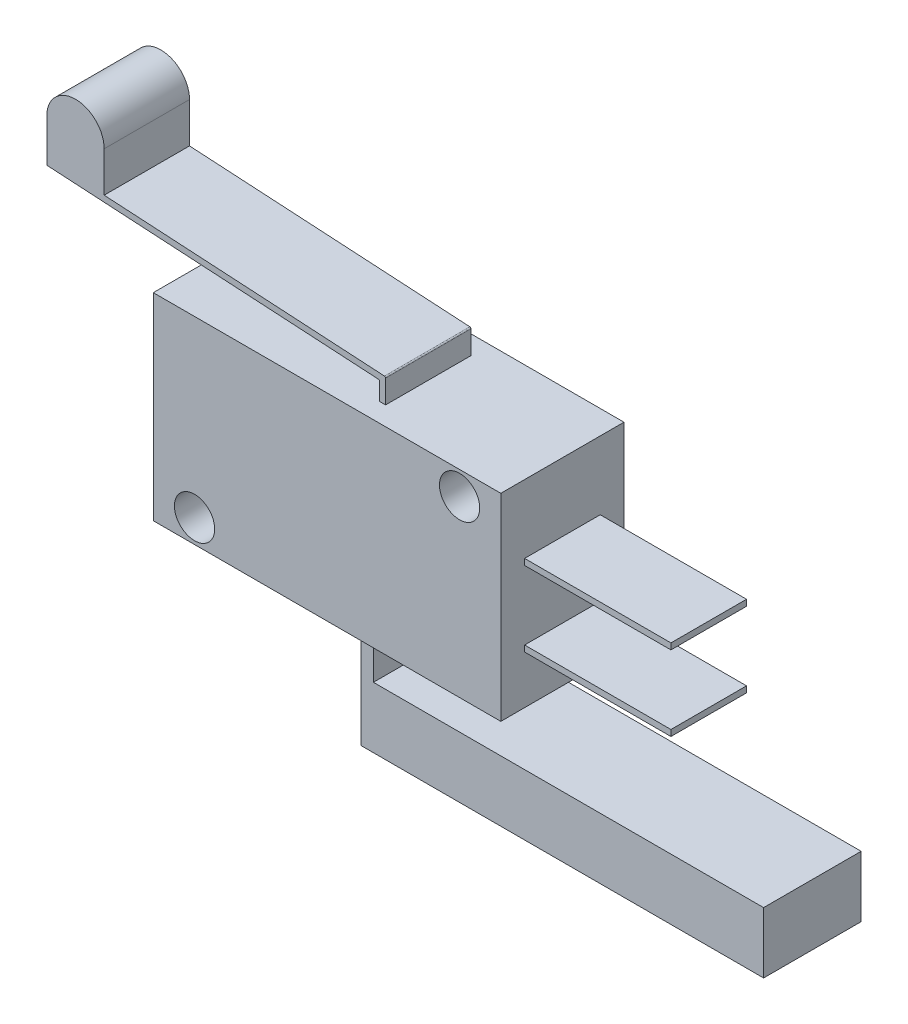
ISO-10303-21;
HEADER;
FILE_DESCRIPTION(('STEP AP214'),'2;1');
FILE_NAME('part.step','',(''),(''),'','','');
FILE_SCHEMA(('AUTOMOTIVE_DESIGN { 1 0 10303 214 1 1 1 1 }'));
ENDSEC;
DATA;
#1=APPLICATION_CONTEXT('core data for automotive mechanical design processes');
#2=APPLICATION_PROTOCOL_DEFINITION('international standard','automotive_design',2000,#1);
#3=PRODUCT_CONTEXT('',#1,'mechanical');
#4=PRODUCT('Part','Part','',(#3));
#5=PRODUCT_RELATED_PRODUCT_CATEGORY('part','',(#4));
#6=PRODUCT_DEFINITION_FORMATION('','',#4);
#7=PRODUCT_DEFINITION_CONTEXT('part definition',#1,'design');
#8=PRODUCT_DEFINITION('design','',#6,#7);
#9=PRODUCT_DEFINITION_SHAPE('','',#8);
#10=(LENGTH_UNIT() NAMED_UNIT(*) SI_UNIT(.MILLI.,.METRE.));
#11=(NAMED_UNIT(*) PLANE_ANGLE_UNIT() SI_UNIT($,.RADIAN.));
#12=(NAMED_UNIT(*) SI_UNIT($,.STERADIAN.) SOLID_ANGLE_UNIT());
#13=UNCERTAINTY_MEASURE_WITH_UNIT(LENGTH_MEASURE(1.E-05),#10,'distance_accuracy_value','');
#14=(GEOMETRIC_REPRESENTATION_CONTEXT(3) GLOBAL_UNCERTAINTY_ASSIGNED_CONTEXT((#13)) GLOBAL_UNIT_ASSIGNED_CONTEXT((#10,
#11,#12)) REPRESENTATION_CONTEXT('',''));
#15=CARTESIAN_POINT('',(0.,0.,0.));
#16=DIRECTION('',(0.,0.,1.));
#17=DIRECTION('',(1.,0.,0.));
#18=AXIS2_PLACEMENT_3D('',#15,#16,#17);
#19=CARTESIAN_POINT('',(-14.25,-8.1,5.05));
#20=DIRECTION('',(0.,1.,0.));
#21=DIRECTION('',(0.,0.,1.));
#22=AXIS2_PLACEMENT_3D('',#19,#20,#21);
#23=PLANE('',#22);
#24=DIRECTION('',(1.,0.,0.));
#25=VECTOR('',#24,1.);
#26=CARTESIAN_POINT('',(-14.25,-8.1,-5.05));
#27=LINE('',#26,#25);
#28=CARTESIAN_POINT('',(-14.25,-8.1,-5.05));
#29=VERTEX_POINT('',#28);
#30=CARTESIAN_POINT('',(14.25,-8.1,-5.05));
#31=VERTEX_POINT('',#30);
#32=EDGE_CURVE('E379',#29,#31,#27,.T.);
#33=ORIENTED_EDGE('',*,*,#32,.T.);
#34=DIRECTION('',(0.,0.,-1.));
#35=VECTOR('',#34,1.);
#36=CARTESIAN_POINT('',(14.25,-8.1,5.05));
#37=LINE('',#36,#35);
#38=CARTESIAN_POINT('',(14.25,-8.1,5.05));
#39=VERTEX_POINT('',#38);
#40=EDGE_CURVE('E385',#39,#31,#37,.T.);
#41=ORIENTED_EDGE('',*,*,#40,.F.);
#42=DIRECTION('',(1.,0.,0.));
#43=VECTOR('',#42,1.);
#44=CARTESIAN_POINT('',(-14.25,-8.1,5.05));
#45=LINE('',#44,#43);
#46=CARTESIAN_POINT('',(-14.25,-8.1,5.05));
#47=VERTEX_POINT('',#46);
#48=EDGE_CURVE('E383',#47,#39,#45,.T.);
#49=ORIENTED_EDGE('',*,*,#48,.F.);
#50=DIRECTION('',(0.,0.,-1.));
#51=VECTOR('',#50,1.);
#52=CARTESIAN_POINT('',(-14.25,-8.1,5.05));
#53=LINE('',#52,#51);
#54=EDGE_CURVE('E395',#47,#29,#53,.T.);
#55=ORIENTED_EDGE('',*,*,#54,.T.);
#56=EDGE_LOOP('',(#33,#41,#49,#55));
#57=FACE_BOUND('',#56,.T.);
#58=DIRECTION('',(-1.,0.,0.));
#59=VECTOR('',#58,1.);
#60=CARTESIAN_POINT('',(2.75,-8.1,4.));
#61=LINE('',#60,#59);
#62=CARTESIAN_POINT('',(2.75,-8.1,4.));
#63=VERTEX_POINT('',#62);
#64=CARTESIAN_POINT('',(1.75,-8.1,4.));
#65=VERTEX_POINT('',#64);
#66=EDGE_CURVE('E225',#63,#65,#61,.T.);
#67=ORIENTED_EDGE('',*,*,#66,.F.);
#68=DIRECTION('',(0.,0.,-1.));
#69=VECTOR('',#68,1.);
#70=CARTESIAN_POINT('',(2.75,-8.1,4.));
#71=LINE('',#70,#69);
#72=CARTESIAN_POINT('',(2.75,-8.1,-4.));
#73=VERTEX_POINT('',#72);
#74=EDGE_CURVE('E866',#63,#73,#71,.T.);
#75=ORIENTED_EDGE('',*,*,#74,.T.);
#76=DIRECTION('',(-1.,0.,0.));
#77=VECTOR('',#76,1.);
#78=CARTESIAN_POINT('',(2.75,-8.1,-4.));
#79=LINE('',#78,#77);
#80=CARTESIAN_POINT('',(1.75,-8.1,-4.));
#81=VERTEX_POINT('',#80);
#82=EDGE_CURVE('E238',#73,#81,#79,.T.);
#83=ORIENTED_EDGE('',*,*,#82,.T.);
#84=DIRECTION('',(0.,0.,-1.));
#85=VECTOR('',#84,1.);
#86=CARTESIAN_POINT('',(1.75,-8.1,4.));
#87=LINE('',#86,#85);
#88=EDGE_CURVE('E50',#65,#81,#87,.T.);
#89=ORIENTED_EDGE('',*,*,#88,.F.);
#90=EDGE_LOOP('',(#67,#75,#83,#89));
#91=FACE_BOUND('',#90,.T.);
#92=ADVANCED_FACE('F35',(#57,#91),#23,.F.);
#93=CARTESIAN_POINT('',(14.25,-8.1,5.05));
#94=DIRECTION('',(-1.,0.,0.));
#95=DIRECTION('',(0.,0.,1.));
#96=AXIS2_PLACEMENT_3D('',#93,#94,#95);
#97=PLANE('',#96);
#98=DIRECTION('',(0.,1.,0.));
#99=VECTOR('',#98,1.);
#100=CARTESIAN_POINT('',(14.25,2.5,-3.1));
#101=LINE('',#100,#99);
#102=CARTESIAN_POINT('',(14.25,2.,-3.1));
#103=VERTEX_POINT('',#102);
#104=CARTESIAN_POINT('',(14.25,2.5,-3.1));
#105=VERTEX_POINT('',#104);
#106=EDGE_CURVE('E274',#103,#105,#101,.T.);
#107=ORIENTED_EDGE('',*,*,#106,.F.);
#108=DIRECTION('',(0.,0.,-1.));
#109=VECTOR('',#108,1.);
#110=CARTESIAN_POINT('',(14.25,2.,3.1));
#111=LINE('',#110,#109);
#112=CARTESIAN_POINT('',(14.25,2.,3.1));
#113=VERTEX_POINT('',#112);
#114=EDGE_CURVE('E279',#113,#103,#111,.T.);
#115=ORIENTED_EDGE('',*,*,#114,.F.);
#116=DIRECTION('',(0.,-1.,0.));
#117=VECTOR('',#116,1.);
#118=CARTESIAN_POINT('',(14.25,2.5,3.1));
#119=LINE('',#118,#117);
#120=CARTESIAN_POINT('',(14.25,2.5,3.1));
#121=VERTEX_POINT('',#120);
#122=EDGE_CURVE('E291',#121,#113,#119,.T.);
#123=ORIENTED_EDGE('',*,*,#122,.F.);
#124=DIRECTION('',(0.,0.,1.));
#125=VECTOR('',#124,1.);
#126=CARTESIAN_POINT('',(14.25,2.5,3.1));
#127=LINE('',#126,#125);
#128=EDGE_CURVE('E288',#105,#121,#127,.T.);
#129=ORIENTED_EDGE('',*,*,#128,.F.);
#130=EDGE_LOOP('',(#107,#115,#123,#129));
#131=FACE_BOUND('',#130,.T.);
#132=DIRECTION('',(0.,1.,0.));
#133=VECTOR('',#132,1.);
#134=CARTESIAN_POINT('',(14.25,-8.1,-5.05));
#135=LINE('',#134,#133);
#136=CARTESIAN_POINT('',(14.25,8.1,-5.05));
#137=VERTEX_POINT('',#136);
#138=EDGE_CURVE('E372',#31,#137,#135,.T.);
#139=ORIENTED_EDGE('',*,*,#138,.T.);
#140=DIRECTION('',(0.,0.,-1.));
#141=VECTOR('',#140,1.);
#142=CARTESIAN_POINT('',(14.25,8.1,5.05));
#143=LINE('',#142,#141);
#144=CARTESIAN_POINT('',(14.25,8.1,5.05));
#145=VERTEX_POINT('',#144);
#146=EDGE_CURVE('E401',#145,#137,#143,.T.);
#147=ORIENTED_EDGE('',*,*,#146,.F.);
#148=DIRECTION('',(0.,1.,0.));
#149=VECTOR('',#148,1.);
#150=CARTESIAN_POINT('',(14.25,-8.1,5.05));
#151=LINE('',#150,#149);
#152=EDGE_CURVE('E375',#39,#145,#151,.T.);
#153=ORIENTED_EDGE('',*,*,#152,.F.);
#154=ORIENTED_EDGE('',*,*,#40,.T.);
#155=EDGE_LOOP('',(#139,#147,#153,#154));
#156=FACE_BOUND('',#155,.T.);
#157=DIRECTION('',(0.,1.,0.));
#158=VECTOR('',#157,1.);
#159=CARTESIAN_POINT('',(14.25,-3.65,-3.10000000000001));
#160=LINE('',#159,#158);
#161=CARTESIAN_POINT('',(14.25,-4.15,-3.10000000000001));
#162=VERTEX_POINT('',#161);
#163=CARTESIAN_POINT('',(14.25,-3.65,-3.10000000000001));
#164=VERTEX_POINT('',#163);
#165=EDGE_CURVE('E239',#162,#164,#160,.T.);
#166=ORIENTED_EDGE('',*,*,#165,.F.);
#167=DIRECTION('',(0.,0.,-1.));
#168=VECTOR('',#167,1.);
#169=CARTESIAN_POINT('',(14.25,-4.15,3.09999999999999));
#170=LINE('',#169,#168);
#171=CARTESIAN_POINT('',(14.25,-4.15,3.09999999999999));
#172=VERTEX_POINT('',#171);
#173=EDGE_CURVE('E251',#172,#162,#170,.T.);
#174=ORIENTED_EDGE('',*,*,#173,.F.);
#175=DIRECTION('',(0.,-1.,0.));
#176=VECTOR('',#175,1.);
#177=CARTESIAN_POINT('',(14.25,-3.65,3.09999999999999));
#178=LINE('',#177,#176);
#179=CARTESIAN_POINT('',(14.25,-3.65,3.09999999999999));
#180=VERTEX_POINT('',#179);
#181=EDGE_CURVE('E259',#180,#172,#178,.T.);
#182=ORIENTED_EDGE('',*,*,#181,.F.);
#183=DIRECTION('',(0.,0.,1.));
#184=VECTOR('',#183,1.);
#185=CARTESIAN_POINT('',(14.25,-3.65,3.09999999999999));
#186=LINE('',#185,#184);
#187=EDGE_CURVE('E58',#164,#180,#186,.T.);
#188=ORIENTED_EDGE('',*,*,#187,.F.);
#189=EDGE_LOOP('',(#166,#174,#182,#188));
#190=FACE_BOUND('',#189,.T.);
#191=ADVANCED_FACE('F477',(#131,#156,#190),#97,.F.);
#192=CARTESIAN_POINT('',(0.,0.,5.05));
#193=DIRECTION('',(0.,0.,-1.));
#194=DIRECTION('',(-1.,0.,0.));
#195=AXIS2_PLACEMENT_3D('',#192,#193,#194);
#196=PLANE('',#195);
#197=ORIENTED_EDGE('',*,*,#152,.T.);
#198=DIRECTION('',(-1.,0.,0.));
#199=VECTOR('',#198,1.);
#200=CARTESIAN_POINT('',(-14.25,8.1,5.05));
#201=LINE('',#200,#199);
#202=CARTESIAN_POINT('',(-14.25,8.1,5.05));
#203=VERTEX_POINT('',#202);
#204=EDGE_CURVE('E378',#145,#203,#201,.T.);
#205=ORIENTED_EDGE('',*,*,#204,.T.);
#206=DIRECTION('',(0.,-1.,0.));
#207=VECTOR('',#206,1.);
#208=CARTESIAN_POINT('',(-14.25,-8.1,5.05));
#209=LINE('',#208,#207);
#210=EDGE_CURVE('E381',#203,#47,#209,.T.);
#211=ORIENTED_EDGE('',*,*,#210,.T.);
#212=ORIENTED_EDGE('',*,*,#48,.T.);
#213=EDGE_LOOP('',(#197,#205,#211,#212));
#214=FACE_BOUND('',#213,.T.);
#215=CARTESIAN_POINT('',(-10.866713512808,-6.17686873359613,5.05));
#216=DIRECTION('',(0.,0.,1.));
#217=DIRECTION('',(1.,0.,0.));
#218=AXIS2_PLACEMENT_3D('',#215,#216,#217);
#219=CIRCLE('',#218,1.65);
#220=CARTESIAN_POINT('',(-9.21671351280801,-6.17686873359613,5.05));
#221=VERTEX_POINT('',#220);
#222=EDGE_CURVE('E369',#221,#221,#219,.T.);
#223=ORIENTED_EDGE('',*,*,#222,.F.);
#224=EDGE_LOOP('',(#223));
#225=FACE_BOUND('',#224,.T.);
#226=CARTESIAN_POINT('',(10.8674667510698,6.17729689008177,5.05));
#227=DIRECTION('',(0.,0.,1.));
#228=DIRECTION('',(1.,0.,0.));
#229=AXIS2_PLACEMENT_3D('',#226,#227,#228);
#230=CIRCLE('',#229,1.65);
#231=CARTESIAN_POINT('',(12.5174667510698,6.17729689008177,5.05));
#232=VERTEX_POINT('',#231);
#233=EDGE_CURVE('E363',#232,#232,#230,.T.);
#234=ORIENTED_EDGE('',*,*,#233,.F.);
#235=EDGE_LOOP('',(#234));
#236=FACE_BOUND('',#235,.T.);
#237=ADVANCED_FACE('F483',(#214,#225,#236),#196,.F.);
#238=CARTESIAN_POINT('',(0.,0.,-5.05));
#239=DIRECTION('',(0.,0.,-1.));
#240=DIRECTION('',(-1.,0.,0.));
#241=AXIS2_PLACEMENT_3D('',#238,#239,#240);
#242=PLANE('',#241);
#243=CARTESIAN_POINT('',(-10.866713512808,-6.17686873359613,-5.05));
#244=DIRECTION('',(0.,0.,1.));
#245=DIRECTION('',(1.,0.,0.));
#246=AXIS2_PLACEMENT_3D('',#243,#244,#245);
#247=CIRCLE('',#246,1.65);
#248=CARTESIAN_POINT('',(-9.21671351280801,-6.17686873359613,-5.05));
#249=VERTEX_POINT('',#248);
#250=EDGE_CURVE('E366',#249,#249,#247,.T.);
#251=ORIENTED_EDGE('',*,*,#250,.T.);
#252=EDGE_LOOP('',(#251));
#253=FACE_BOUND('',#252,.T.);
#254=ORIENTED_EDGE('',*,*,#138,.F.);
#255=ORIENTED_EDGE('',*,*,#32,.F.);
#256=DIRECTION('',(0.,-1.,0.));
#257=VECTOR('',#256,1.);
#258=CARTESIAN_POINT('',(-14.25,-8.1,-5.05));
#259=LINE('',#258,#257);
#260=CARTESIAN_POINT('',(-14.25,8.1,-5.05));
#261=VERTEX_POINT('',#260);
#262=EDGE_CURVE('E390',#261,#29,#259,.T.);
#263=ORIENTED_EDGE('',*,*,#262,.F.);
#264=DIRECTION('',(-1.,0.,0.));
#265=VECTOR('',#264,1.);
#266=CARTESIAN_POINT('',(-14.25,8.1,-5.05));
#267=LINE('',#266,#265);
#268=EDGE_CURVE('E388',#137,#261,#267,.T.);
#269=ORIENTED_EDGE('',*,*,#268,.F.);
#270=EDGE_LOOP('',(#254,#255,#263,#269));
#271=FACE_BOUND('',#270,.T.);
#272=CARTESIAN_POINT('',(10.8674667510698,6.17729689008177,-5.05));
#273=DIRECTION('',(0.,0.,1.));
#274=DIRECTION('',(1.,0.,0.));
#275=AXIS2_PLACEMENT_3D('',#272,#273,#274);
#276=CIRCLE('',#275,1.65);
#277=CARTESIAN_POINT('',(12.5174667510698,6.17729689008177,-5.05));
#278=VERTEX_POINT('',#277);
#279=EDGE_CURVE('E362',#278,#278,#276,.T.);
#280=ORIENTED_EDGE('',*,*,#279,.T.);
#281=EDGE_LOOP('',(#280));
#282=FACE_BOUND('',#281,.T.);
#283=ADVANCED_FACE('F488',(#253,#271,#282),#242,.T.);
#284=CARTESIAN_POINT('',(-14.25,8.1,5.05));
#285=DIRECTION('',(0.,-1.,0.));
#286=DIRECTION('',(0.,0.,-1.));
#287=AXIS2_PLACEMENT_3D('',#284,#285,#286);
#288=PLANE('',#287);
#289=DIRECTION('',(0.,0.,-1.));
#290=VECTOR('',#289,1.);
#291=CARTESIAN_POINT('',(3.25,8.1,3.5));
#292=LINE('',#291,#290);
#293=CARTESIAN_POINT('',(3.25,8.1,3.5));
#294=VERTEX_POINT('',#293);
#295=CARTESIAN_POINT('',(3.25,8.1,-3.5));
#296=VERTEX_POINT('',#295);
#297=EDGE_CURVE('E359',#294,#296,#292,.T.);
#298=ORIENTED_EDGE('',*,*,#297,.F.);
#299=DIRECTION('',(1.,0.,0.));
#300=VECTOR('',#299,1.);
#301=CARTESIAN_POINT('',(3.25,8.1,3.5));
#302=LINE('',#301,#300);
#303=CARTESIAN_POINT('',(2.75,8.1,3.5));
#304=VERTEX_POINT('',#303);
#305=EDGE_CURVE('E308',#304,#294,#302,.T.);
#306=ORIENTED_EDGE('',*,*,#305,.F.);
#307=DIRECTION('',(0.,0.,-1.));
#308=VECTOR('',#307,1.);
#309=CARTESIAN_POINT('',(2.75,8.1,3.5));
#310=LINE('',#309,#308);
#311=CARTESIAN_POINT('',(2.75,8.1,-3.5));
#312=VERTEX_POINT('',#311);
#313=EDGE_CURVE('E328',#304,#312,#310,.T.);
#314=ORIENTED_EDGE('',*,*,#313,.T.);
#315=DIRECTION('',(1.,0.,0.));
#316=VECTOR('',#315,1.);
#317=CARTESIAN_POINT('',(3.25,8.1,-3.5));
#318=LINE('',#317,#316);
#319=EDGE_CURVE('E307',#312,#296,#318,.T.);
#320=ORIENTED_EDGE('',*,*,#319,.T.);
#321=EDGE_LOOP('',(#298,#306,#314,#320));
#322=FACE_BOUND('',#321,.T.);
#323=ORIENTED_EDGE('',*,*,#268,.T.);
#324=DIRECTION('',(0.,0.,-1.));
#325=VECTOR('',#324,1.);
#326=CARTESIAN_POINT('',(-14.25,8.1,5.05));
#327=LINE('',#326,#325);
#328=EDGE_CURVE('E398',#203,#261,#327,.T.);
#329=ORIENTED_EDGE('',*,*,#328,.F.);
#330=ORIENTED_EDGE('',*,*,#204,.F.);
#331=ORIENTED_EDGE('',*,*,#146,.T.);
#332=EDGE_LOOP('',(#323,#329,#330,#331));
#333=FACE_BOUND('',#332,.T.);
#334=ADVANCED_FACE('F440',(#322,#333),#288,.F.);
#335=CARTESIAN_POINT('',(-14.25,-8.1,5.05));
#336=DIRECTION('',(1.,0.,0.));
#337=DIRECTION('',(0.,0.,-1.));
#338=AXIS2_PLACEMENT_3D('',#335,#336,#337);
#339=PLANE('',#338);
#340=ORIENTED_EDGE('',*,*,#262,.T.);
#341=ORIENTED_EDGE('',*,*,#54,.F.);
#342=ORIENTED_EDGE('',*,*,#210,.F.);
#343=ORIENTED_EDGE('',*,*,#328,.T.);
#344=EDGE_LOOP('',(#340,#341,#342,#343));
#345=FACE_BOUND('',#344,.T.);
#346=ADVANCED_FACE('F490',(#345),#339,.F.);
#347=CARTESIAN_POINT('',(-10.866713512808,-6.17686873359613,5.05));
#348=DIRECTION('',(0.,0.,-1.));
#349=DIRECTION('',(-1.,0.,0.));
#350=AXIS2_PLACEMENT_3D('',#347,#348,#349);
#351=CYLINDRICAL_SURFACE('',#350,1.65);
#352=ORIENTED_EDGE('',*,*,#222,.T.);
#353=EDGE_LOOP('',(#352));
#354=FACE_BOUND('',#353,.T.);
#355=ORIENTED_EDGE('',*,*,#250,.F.);
#356=EDGE_LOOP('',(#355));
#357=FACE_BOUND('',#356,.T.);
#358=ADVANCED_FACE('F493',(#354,#357),#351,.F.);
#359=CARTESIAN_POINT('',(10.8674667510698,6.17729689008177,5.05));
#360=DIRECTION('',(0.,0.,-1.));
#361=DIRECTION('',(-1.,0.,0.));
#362=AXIS2_PLACEMENT_3D('',#359,#360,#361);
#363=CYLINDRICAL_SURFACE('',#362,1.65);
#364=ORIENTED_EDGE('',*,*,#233,.T.);
#365=EDGE_LOOP('',(#364));
#366=FACE_BOUND('',#365,.T.);
#367=ORIENTED_EDGE('',*,*,#279,.F.);
#368=EDGE_LOOP('',(#367));
#369=FACE_BOUND('',#368,.T.);
#370=ADVANCED_FACE('F774',(#366,#369),#363,.F.);
#371=CARTESIAN_POINT('',(3.25,10.1,3.5));
#372=DIRECTION('',(-1.,0.,0.));
#373=DIRECTION('',(0.,-1.,0.));
#374=AXIS2_PLACEMENT_3D('',#371,#372,#373);
#375=PLANE('',#374);
#376=DIRECTION('',(0.,1.,0.));
#377=VECTOR('',#376,1.);
#378=CARTESIAN_POINT('',(3.25,10.1,-3.5));
#379=LINE('',#378,#377);
#380=CARTESIAN_POINT('',(3.25,10.0057046137251,-3.5));
#381=VERTEX_POINT('',#380);
#382=EDGE_CURVE('E330',#296,#381,#379,.T.);
#383=ORIENTED_EDGE('',*,*,#382,.T.);
#384=DIRECTION('',(0.,0.,-1.));
#385=VECTOR('',#384,1.);
#386=CARTESIAN_POINT('',(3.25,10.0057046137251,3.5));
#387=LINE('',#386,#385);
#388=CARTESIAN_POINT('',(3.25,10.0057046137251,3.5));
#389=VERTEX_POINT('',#388);
#390=EDGE_CURVE('E409',#381,#389,#387,.F.);
#391=ORIENTED_EDGE('',*,*,#390,.T.);
#392=DIRECTION('',(0.,1.,0.));
#393=VECTOR('',#392,1.);
#394=CARTESIAN_POINT('',(3.25,10.1,3.5));
#395=LINE('',#394,#393);
#396=EDGE_CURVE('E311',#294,#389,#395,.T.);
#397=ORIENTED_EDGE('',*,*,#396,.F.);
#398=ORIENTED_EDGE('',*,*,#297,.T.);
#399=EDGE_LOOP('',(#383,#391,#397,#398));
#400=FACE_BOUND('',#399,.T.);
#401=ADVANCED_FACE('F446',(#400),#375,.F.);
#402=CARTESIAN_POINT('',(-19.83,11.4564509541792,3.5));
#403=DIRECTION('',(-0.0586704652507121,-0.998277404586153,0.));
#404=DIRECTION('',(0.998277404586153,-0.0586704652507121,0.));
#405=AXIS2_PLACEMENT_3D('',#402,#403,#404);
#406=PLANE('',#405);
#407=DIRECTION('',(-0.998277404586153,0.0586704652507121,0.));
#408=VECTOR('',#407,1.);
#409=CARTESIAN_POINT('',(-19.83,11.4564509541792,3.5));
#410=LINE('',#409,#408);
#411=CARTESIAN_POINT('',(3.15586704652508,10.1055323541837,3.5));
#412=VERTEX_POINT('',#411);
#413=CARTESIAN_POINT('',(-19.83,11.4564509541792,3.5));
#414=VERTEX_POINT('',#413);
#415=EDGE_CURVE('E315',#412,#414,#410,.T.);
#416=ORIENTED_EDGE('',*,*,#415,.F.);
#417=DIRECTION('',(0.,0.,-1.));
#418=VECTOR('',#417,1.);
#419=CARTESIAN_POINT('',(3.15586704652508,10.1055323541837,3.5));
#420=LINE('',#419,#418);
#421=CARTESIAN_POINT('',(3.15586704652508,10.1055323541837,-3.5));
#422=VERTEX_POINT('',#421);
#423=EDGE_CURVE('E404',#412,#422,#420,.T.);
#424=ORIENTED_EDGE('',*,*,#423,.T.);
#425=DIRECTION('',(-0.998277404586153,0.0586704652507121,0.));
#426=VECTOR('',#425,1.);
#427=CARTESIAN_POINT('',(-19.83,11.4564509541792,-3.5));
#428=LINE('',#427,#426);
#429=CARTESIAN_POINT('',(-19.83,11.4564509541792,-3.5));
#430=VERTEX_POINT('',#429);
#431=EDGE_CURVE('E333',#422,#430,#428,.T.);
#432=ORIENTED_EDGE('',*,*,#431,.T.);
#433=DIRECTION('',(0.,0.,-1.));
#434=VECTOR('',#433,1.);
#435=CARTESIAN_POINT('',(-19.83,11.4564509541792,3.5));
#436=LINE('',#435,#434);
#437=EDGE_CURVE('E356',#414,#430,#436,.T.);
#438=ORIENTED_EDGE('',*,*,#437,.F.);
#439=EDGE_LOOP('',(#416,#424,#432,#438));
#440=FACE_BOUND('',#439,.T.);
#441=ADVANCED_FACE('F453',(#440),#406,.F.);
#442=CARTESIAN_POINT('',(-19.83,14.75,3.5));
#443=DIRECTION('',(-1.,0.,0.));
#444=DIRECTION('',(0.,0.,1.));
#445=AXIS2_PLACEMENT_3D('',#442,#443,#444);
#446=PLANE('',#445);
#447=DIRECTION('',(0.,1.,0.));
#448=VECTOR('',#447,1.);
#449=CARTESIAN_POINT('',(-19.83,14.75,-3.5));
#450=LINE('',#449,#448);
#451=CARTESIAN_POINT('',(-19.83,14.75,-3.5));
#452=VERTEX_POINT('',#451);
#453=EDGE_CURVE('E335',#430,#452,#450,.T.);
#454=ORIENTED_EDGE('',*,*,#453,.T.);
#455=DIRECTION('',(0.,0.,-1.));
#456=VECTOR('',#455,1.);
#457=CARTESIAN_POINT('',(-19.83,14.75,3.5));
#458=LINE('',#457,#456);
#459=CARTESIAN_POINT('',(-19.83,14.75,3.5));
#460=VERTEX_POINT('',#459);
#461=EDGE_CURVE('E353',#460,#452,#458,.T.);
#462=ORIENTED_EDGE('',*,*,#461,.F.);
#463=DIRECTION('',(0.,1.,0.));
#464=VECTOR('',#463,1.);
#465=CARTESIAN_POINT('',(-19.83,14.75,3.5));
#466=LINE('',#465,#464);
#467=EDGE_CURVE('E317',#414,#460,#466,.T.);
#468=ORIENTED_EDGE('',*,*,#467,.F.);
#469=ORIENTED_EDGE('',*,*,#437,.T.);
#470=EDGE_LOOP('',(#454,#462,#468,#469));
#471=FACE_BOUND('',#470,.T.);
#472=ADVANCED_FACE('F459',(#471),#446,.F.);
#473=CARTESIAN_POINT('',(-22.18,14.75,3.5));
#474=DIRECTION('',(0.,0.,-1.));
#475=DIRECTION('',(-1.,0.,0.));
#476=AXIS2_PLACEMENT_3D('',#473,#474,#475);
#477=CYLINDRICAL_SURFACE('',#476,2.35);
#478=CARTESIAN_POINT('',(-22.18,14.75,-3.5));
#479=DIRECTION('',(0.,0.,1.));
#480=DIRECTION('',(1.,0.,0.));
#481=AXIS2_PLACEMENT_3D('',#478,#479,#480);
#482=CIRCLE('',#481,2.35);
#483=CARTESIAN_POINT('',(-24.53,14.75,-3.5));
#484=VERTEX_POINT('',#483);
#485=EDGE_CURVE('E337',#452,#484,#482,.T.);
#486=ORIENTED_EDGE('',*,*,#485,.T.);
#487=DIRECTION('',(0.,0.,-1.));
#488=VECTOR('',#487,1.);
#489=CARTESIAN_POINT('',(-24.53,14.75,3.5));
#490=LINE('',#489,#488);
#491=CARTESIAN_POINT('',(-24.53,14.75,3.5));
#492=VERTEX_POINT('',#491);
#493=EDGE_CURVE('E350',#492,#484,#490,.T.);
#494=ORIENTED_EDGE('',*,*,#493,.F.);
#495=CARTESIAN_POINT('',(-22.18,14.75,3.5));
#496=DIRECTION('',(0.,0.,1.));
#497=DIRECTION('',(1.,0.,0.));
#498=AXIS2_PLACEMENT_3D('',#495,#496,#497);
#499=CIRCLE('',#498,2.35);
#500=EDGE_CURVE('E319',#460,#492,#499,.T.);
#501=ORIENTED_EDGE('',*,*,#500,.F.);
#502=ORIENTED_EDGE('',*,*,#461,.T.);
#503=EDGE_LOOP('',(#486,#494,#501,#502));
#504=FACE_BOUND('',#503,.T.);
#505=ADVANCED_FACE('F463',(#504),#477,.T.);
#506=CARTESIAN_POINT('',(-24.53,11.2318151843106,3.5));
#507=DIRECTION('',(1.,0.,0.));
#508=DIRECTION('',(0.,1.,0.));
#509=AXIS2_PLACEMENT_3D('',#506,#507,#508);
#510=PLANE('',#509);
#511=DIRECTION('',(0.,-1.,0.));
#512=VECTOR('',#511,1.);
#513=CARTESIAN_POINT('',(-24.53,11.2318151843106,-3.5));
#514=LINE('',#513,#512);
#515=CARTESIAN_POINT('',(-24.53,11.2318151843106,-3.5));
#516=VERTEX_POINT('',#515);
#517=EDGE_CURVE('E339',#484,#516,#514,.T.);
#518=ORIENTED_EDGE('',*,*,#517,.T.);
#519=DIRECTION('',(0.,0.,-1.));
#520=VECTOR('',#519,1.);
#521=CARTESIAN_POINT('',(-24.53,11.2318151843106,3.5));
#522=LINE('',#521,#520);
#523=CARTESIAN_POINT('',(-24.53,11.2318151843106,3.5));
#524=VERTEX_POINT('',#523);
#525=EDGE_CURVE('E347',#524,#516,#522,.T.);
#526=ORIENTED_EDGE('',*,*,#525,.F.);
#527=DIRECTION('',(0.,-1.,0.));
#528=VECTOR('',#527,1.);
#529=CARTESIAN_POINT('',(-24.53,11.2318151843106,3.5));
#530=LINE('',#529,#528);
#531=EDGE_CURVE('E321',#492,#524,#530,.T.);
#532=ORIENTED_EDGE('',*,*,#531,.F.);
#533=ORIENTED_EDGE('',*,*,#493,.T.);
#534=EDGE_LOOP('',(#518,#526,#532,#533));
#535=FACE_BOUND('',#534,.T.);
#536=ADVANCED_FACE('F467',(#535),#510,.F.);
#537=CARTESIAN_POINT('',(-24.53,11.2318151843106,3.5));
#538=DIRECTION('',(0.0586704652507121,0.998277404586153,0.));
#539=DIRECTION('',(-0.998277404586153,0.0586704652507121,0.));
#540=AXIS2_PLACEMENT_3D('',#537,#538,#539);
#541=PLANE('',#540);
#542=DIRECTION('',(0.998277404586153,-0.0586704652507121,0.));
#543=VECTOR('',#542,1.);
#544=CARTESIAN_POINT('',(-24.53,11.2318151843106,-3.5));
#545=LINE('',#544,#543);
#546=CARTESIAN_POINT('',(2.65586704652507,9.63405542280938,-3.5));
#547=VERTEX_POINT('',#546);
#548=EDGE_CURVE('E341',#516,#547,#545,.T.);
#549=ORIENTED_EDGE('',*,*,#548,.T.);
#550=DIRECTION('',(0.,0.,-1.));
#551=VECTOR('',#550,1.);
#552=CARTESIAN_POINT('',(2.65586704652507,9.63405542280938,3.5));
#553=LINE('',#552,#551);
#554=CARTESIAN_POINT('',(2.65586704652507,9.63405542280938,3.5));
#555=VERTEX_POINT('',#554);
#556=EDGE_CURVE('E416',#547,#555,#553,.F.);
#557=ORIENTED_EDGE('',*,*,#556,.T.);
#558=DIRECTION('',(0.998277404586153,-0.0586704652507121,0.));
#559=VECTOR('',#558,1.);
#560=CARTESIAN_POINT('',(-24.53,11.2318151843106,3.5));
#561=LINE('',#560,#559);
#562=EDGE_CURVE('E323',#524,#555,#561,.T.);
#563=ORIENTED_EDGE('',*,*,#562,.F.);
#564=ORIENTED_EDGE('',*,*,#525,.T.);
#565=EDGE_LOOP('',(#549,#557,#563,#564));
#566=FACE_BOUND('',#565,.T.);
#567=ADVANCED_FACE('F428',(#566),#541,.F.);
#568=CARTESIAN_POINT('',(2.75,8.1,3.5));
#569=DIRECTION('',(1.,0.,0.));
#570=DIRECTION('',(0.,1.,0.));
#571=AXIS2_PLACEMENT_3D('',#568,#569,#570);
#572=PLANE('',#571);
#573=DIRECTION('',(0.,-1.,0.));
#574=VECTOR('',#573,1.);
#575=CARTESIAN_POINT('',(2.75,8.1,3.5));
#576=LINE('',#575,#574);
#577=CARTESIAN_POINT('',(2.75,9.53422768235076,3.5));
#578=VERTEX_POINT('',#577);
#579=EDGE_CURVE('E326',#578,#304,#576,.T.);
#580=ORIENTED_EDGE('',*,*,#579,.F.);
#581=DIRECTION('',(0.,0.,-1.));
#582=VECTOR('',#581,1.);
#583=CARTESIAN_POINT('',(2.75,9.53422768235076,-3.5));
#584=LINE('',#583,#582);
#585=CARTESIAN_POINT('',(2.75,9.53422768235076,-3.5));
#586=VERTEX_POINT('',#585);
#587=EDGE_CURVE('E413',#578,#586,#584,.T.);
#588=ORIENTED_EDGE('',*,*,#587,.T.);
#589=DIRECTION('',(0.,-1.,0.));
#590=VECTOR('',#589,1.);
#591=CARTESIAN_POINT('',(2.75,8.1,-3.5));
#592=LINE('',#591,#590);
#593=EDGE_CURVE('E312',#586,#312,#592,.T.);
#594=ORIENTED_EDGE('',*,*,#593,.T.);
#595=ORIENTED_EDGE('',*,*,#313,.F.);
#596=EDGE_LOOP('',(#580,#588,#594,#595));
#597=FACE_BOUND('',#596,.T.);
#598=ADVANCED_FACE('F438',(#597),#572,.F.);
#599=CARTESIAN_POINT('',(-22.18,14.75,3.5));
#600=DIRECTION('',(0.,0.,1.));
#601=DIRECTION('',(1.,0.,0.));
#602=AXIS2_PLACEMENT_3D('',#599,#600,#601);
#603=PLANE('',#602);
#604=ORIENTED_EDGE('',*,*,#396,.T.);
#605=CARTESIAN_POINT('',(3.15,10.0057046137251,3.5));
#606=DIRECTION('',(0.,0.,1.));
#607=DIRECTION('',(1.,0.,0.));
#608=AXIS2_PLACEMENT_3D('',#605,#606,#607);
#609=CIRCLE('',#608,0.1);
#610=EDGE_CURVE('E411',#389,#412,#609,.T.);
#611=ORIENTED_EDGE('',*,*,#610,.T.);
#612=ORIENTED_EDGE('',*,*,#415,.T.);
#613=ORIENTED_EDGE('',*,*,#467,.T.);
#614=ORIENTED_EDGE('',*,*,#500,.T.);
#615=ORIENTED_EDGE('',*,*,#531,.T.);
#616=ORIENTED_EDGE('',*,*,#562,.T.);
#617=CARTESIAN_POINT('',(2.65,9.53422768235076,3.5));
#618=DIRECTION('',(0.,0.,1.));
#619=DIRECTION('',(1.,0.,0.));
#620=AXIS2_PLACEMENT_3D('',#617,#618,#619);
#621=CIRCLE('',#620,0.1);
#622=EDGE_CURVE('E11',#555,#578,#621,.F.);
#623=ORIENTED_EDGE('',*,*,#622,.T.);
#624=ORIENTED_EDGE('',*,*,#579,.T.);
#625=ORIENTED_EDGE('',*,*,#305,.T.);
#626=EDGE_LOOP('',(#604,#611,#612,#613,#614,#615,#616,#623,#624,#625));
#627=FACE_BOUND('',#626,.T.);
#628=ADVANCED_FACE('F434',(#627),#603,.T.);
#629=CARTESIAN_POINT('',(-22.18,14.75,-3.5));
#630=DIRECTION('',(0.,0.,1.));
#631=DIRECTION('',(1.,0.,0.));
#632=AXIS2_PLACEMENT_3D('',#629,#630,#631);
#633=PLANE('',#632);
#634=ORIENTED_EDGE('',*,*,#431,.F.);
#635=CARTESIAN_POINT('',(3.15,10.0057046137251,-3.5));
#636=DIRECTION('',(0.,0.,1.));
#637=DIRECTION('',(1.,0.,0.));
#638=AXIS2_PLACEMENT_3D('',#635,#636,#637);
#639=CIRCLE('',#638,0.1);
#640=EDGE_CURVE('E407',#422,#381,#639,.F.);
#641=ORIENTED_EDGE('',*,*,#640,.T.);
#642=ORIENTED_EDGE('',*,*,#382,.F.);
#643=ORIENTED_EDGE('',*,*,#319,.F.);
#644=ORIENTED_EDGE('',*,*,#593,.F.);
#645=CARTESIAN_POINT('',(2.65,9.53422768235076,-3.5));
#646=DIRECTION('',(0.,0.,1.));
#647=DIRECTION('',(1.,0.,0.));
#648=AXIS2_PLACEMENT_3D('',#645,#646,#647);
#649=CIRCLE('',#648,0.1);
#650=EDGE_CURVE('E43',#586,#547,#649,.T.);
#651=ORIENTED_EDGE('',*,*,#650,.T.);
#652=ORIENTED_EDGE('',*,*,#548,.F.);
#653=ORIENTED_EDGE('',*,*,#517,.F.);
#654=ORIENTED_EDGE('',*,*,#485,.F.);
#655=ORIENTED_EDGE('',*,*,#453,.F.);
#656=EDGE_LOOP('',(#634,#641,#642,#643,#644,#651,#652,#653,#654,#655));
#657=FACE_BOUND('',#656,.T.);
#658=ADVANCED_FACE('F421',(#657),#633,.F.);
#659=CARTESIAN_POINT('',(3.15,10.0057046137251,3.5));
#660=DIRECTION('',(0.,0.,-1.));
#661=DIRECTION('',(-1.,0.,0.));
#662=AXIS2_PLACEMENT_3D('',#659,#660,#661);
#663=CYLINDRICAL_SURFACE('',#662,0.1);
#664=ORIENTED_EDGE('',*,*,#610,.F.);
#665=ORIENTED_EDGE('',*,*,#390,.F.);
#666=ORIENTED_EDGE('',*,*,#640,.F.);
#667=ORIENTED_EDGE('',*,*,#423,.F.);
#668=EDGE_LOOP('',(#664,#665,#666,#667));
#669=FACE_BOUND('',#668,.T.);
#670=ADVANCED_FACE('F451',(#669),#663,.T.);
#671=CARTESIAN_POINT('',(2.65,9.53422768235076,3.5));
#672=DIRECTION('',(0.,0.,1.));
#673=DIRECTION('',(1.,0.,0.));
#674=AXIS2_PLACEMENT_3D('',#671,#672,#673);
#675=CYLINDRICAL_SURFACE('',#674,0.1);
#676=ORIENTED_EDGE('',*,*,#622,.F.);
#677=ORIENTED_EDGE('',*,*,#556,.F.);
#678=ORIENTED_EDGE('',*,*,#650,.F.);
#679=ORIENTED_EDGE('',*,*,#587,.F.);
#680=EDGE_LOOP('',(#676,#677,#678,#679));
#681=FACE_BOUND('',#680,.T.);
#682=ADVANCED_FACE('F37',(#681),#675,.F.);
#683=CARTESIAN_POINT('',(26.25,2.5,-3.1));
#684=DIRECTION('',(0.,0.,1.));
#685=DIRECTION('',(0.,-1.,0.));
#686=AXIS2_PLACEMENT_3D('',#683,#684,#685);
#687=PLANE('',#686);
#688=ORIENTED_EDGE('',*,*,#106,.T.);
#689=DIRECTION('',(-1.,0.,0.));
#690=VECTOR('',#689,1.);
#691=CARTESIAN_POINT('',(26.25,2.5,-3.1));
#692=LINE('',#691,#690);
#693=CARTESIAN_POINT('',(26.25,2.5,-3.1));
#694=VERTEX_POINT('',#693);
#695=EDGE_CURVE('E304',#694,#105,#692,.T.);
#696=ORIENTED_EDGE('',*,*,#695,.F.);
#697=DIRECTION('',(0.,1.,0.));
#698=VECTOR('',#697,1.);
#699=CARTESIAN_POINT('',(26.25,2.5,-3.1));
#700=LINE('',#699,#698);
#701=CARTESIAN_POINT('',(26.25,2.,-3.1));
#702=VERTEX_POINT('',#701);
#703=EDGE_CURVE('E275',#702,#694,#700,.T.);
#704=ORIENTED_EDGE('',*,*,#703,.F.);
#705=DIRECTION('',(-1.,0.,0.));
#706=VECTOR('',#705,1.);
#707=CARTESIAN_POINT('',(26.25,2.,-3.1));
#708=LINE('',#707,#706);
#709=EDGE_CURVE('E285',#702,#103,#708,.T.);
#710=ORIENTED_EDGE('',*,*,#709,.T.);
#711=EDGE_LOOP('',(#688,#696,#704,#710));
#712=FACE_BOUND('',#711,.T.);
#713=ADVANCED_FACE('F501',(#712),#687,.F.);
#714=CARTESIAN_POINT('',(26.25,2.5,3.1));
#715=DIRECTION('',(0.,-1.,0.));
#716=DIRECTION('',(0.,0.,-1.));
#717=AXIS2_PLACEMENT_3D('',#714,#715,#716);
#718=PLANE('',#717);
#719=ORIENTED_EDGE('',*,*,#128,.T.);
#720=DIRECTION('',(-1.,0.,0.));
#721=VECTOR('',#720,1.);
#722=CARTESIAN_POINT('',(26.25,2.5,3.1));
#723=LINE('',#722,#721);
#724=CARTESIAN_POINT('',(26.25,2.5,3.1));
#725=VERTEX_POINT('',#724);
#726=EDGE_CURVE('E301',#725,#121,#723,.T.);
#727=ORIENTED_EDGE('',*,*,#726,.F.);
#728=DIRECTION('',(0.,0.,1.));
#729=VECTOR('',#728,1.);
#730=CARTESIAN_POINT('',(26.25,2.5,3.1));
#731=LINE('',#730,#729);
#732=EDGE_CURVE('E278',#694,#725,#731,.T.);
#733=ORIENTED_EDGE('',*,*,#732,.F.);
#734=ORIENTED_EDGE('',*,*,#695,.T.);
#735=EDGE_LOOP('',(#719,#727,#733,#734));
#736=FACE_BOUND('',#735,.T.);
#737=ADVANCED_FACE('F536',(#736),#718,.F.);
#738=CARTESIAN_POINT('',(26.25,2.5,3.1));
#739=DIRECTION('',(0.,0.,-1.));
#740=DIRECTION('',(-1.,0.,0.));
#741=AXIS2_PLACEMENT_3D('',#738,#739,#740);
#742=PLANE('',#741);
#743=ORIENTED_EDGE('',*,*,#122,.T.);
#744=DIRECTION('',(-1.,0.,0.));
#745=VECTOR('',#744,1.);
#746=CARTESIAN_POINT('',(26.25,2.,3.1));
#747=LINE('',#746,#745);
#748=CARTESIAN_POINT('',(26.25,2.,3.1));
#749=VERTEX_POINT('',#748);
#750=EDGE_CURVE('E298',#749,#113,#747,.T.);
#751=ORIENTED_EDGE('',*,*,#750,.F.);
#752=DIRECTION('',(0.,-1.,0.));
#753=VECTOR('',#752,1.);
#754=CARTESIAN_POINT('',(26.25,2.5,3.1));
#755=LINE('',#754,#753);
#756=EDGE_CURVE('E281',#725,#749,#755,.T.);
#757=ORIENTED_EDGE('',*,*,#756,.F.);
#758=ORIENTED_EDGE('',*,*,#726,.T.);
#759=EDGE_LOOP('',(#743,#751,#757,#758));
#760=FACE_BOUND('',#759,.T.);
#761=ADVANCED_FACE('F544',(#760),#742,.F.);
#762=CARTESIAN_POINT('',(26.25,2.,3.1));
#763=DIRECTION('',(0.,1.,0.));
#764=DIRECTION('',(0.,0.,1.));
#765=AXIS2_PLACEMENT_3D('',#762,#763,#764);
#766=PLANE('',#765);
#767=ORIENTED_EDGE('',*,*,#114,.T.);
#768=ORIENTED_EDGE('',*,*,#709,.F.);
#769=DIRECTION('',(0.,0.,-1.));
#770=VECTOR('',#769,1.);
#771=CARTESIAN_POINT('',(26.25,2.,3.1));
#772=LINE('',#771,#770);
#773=EDGE_CURVE('E283',#749,#702,#772,.T.);
#774=ORIENTED_EDGE('',*,*,#773,.F.);
#775=ORIENTED_EDGE('',*,*,#750,.T.);
#776=EDGE_LOOP('',(#767,#768,#774,#775));
#777=FACE_BOUND('',#776,.T.);
#778=ADVANCED_FACE('F553',(#777),#766,.F.);
#779=CARTESIAN_POINT('',(26.25,0.,0.));
#780=DIRECTION('',(1.,0.,0.));
#781=DIRECTION('',(0.,0.,-1.));
#782=AXIS2_PLACEMENT_3D('',#779,#780,#781);
#783=PLANE('',#782);
#784=ORIENTED_EDGE('',*,*,#703,.T.);
#785=ORIENTED_EDGE('',*,*,#732,.T.);
#786=ORIENTED_EDGE('',*,*,#756,.T.);
#787=ORIENTED_EDGE('',*,*,#773,.T.);
#788=EDGE_LOOP('',(#784,#785,#786,#787));
#789=FACE_BOUND('',#788,.T.);
#790=ADVANCED_FACE('F562',(#789),#783,.T.);
#791=CARTESIAN_POINT('',(26.25,-3.65,-3.10000000000001));
#792=DIRECTION('',(0.,0.,1.));
#793=DIRECTION('',(1.,0.,0.));
#794=AXIS2_PLACEMENT_3D('',#791,#792,#793);
#795=PLANE('',#794);
#796=ORIENTED_EDGE('',*,*,#165,.T.);
#797=DIRECTION('',(-1.,0.,0.));
#798=VECTOR('',#797,1.);
#799=CARTESIAN_POINT('',(26.25,-3.65,-3.10000000000001));
#800=LINE('',#799,#798);
#801=CARTESIAN_POINT('',(26.25,-3.65,-3.10000000000001));
#802=VERTEX_POINT('',#801);
#803=EDGE_CURVE('E272',#802,#164,#800,.T.);
#804=ORIENTED_EDGE('',*,*,#803,.F.);
#805=DIRECTION('',(0.,1.,0.));
#806=VECTOR('',#805,1.);
#807=CARTESIAN_POINT('',(26.25,-3.65,-3.10000000000001));
#808=LINE('',#807,#806);
#809=CARTESIAN_POINT('',(26.25,-4.15,-3.10000000000001));
#810=VERTEX_POINT('',#809);
#811=EDGE_CURVE('E247',#810,#802,#808,.T.);
#812=ORIENTED_EDGE('',*,*,#811,.F.);
#813=DIRECTION('',(-1.,0.,0.));
#814=VECTOR('',#813,1.);
#815=CARTESIAN_POINT('',(26.25,-4.15,-3.10000000000001));
#816=LINE('',#815,#814);
#817=EDGE_CURVE('E256',#810,#162,#816,.T.);
#818=ORIENTED_EDGE('',*,*,#817,.T.);
#819=EDGE_LOOP('',(#796,#804,#812,#818));
#820=FACE_BOUND('',#819,.T.);
#821=ADVANCED_FACE('F571',(#820),#795,.F.);
#822=CARTESIAN_POINT('',(26.25,-3.65,3.09999999999999));
#823=DIRECTION('',(0.,-1.,0.));
#824=DIRECTION('',(0.,0.,-1.));
#825=AXIS2_PLACEMENT_3D('',#822,#823,#824);
#826=PLANE('',#825);
#827=ORIENTED_EDGE('',*,*,#187,.T.);
#828=DIRECTION('',(-1.,0.,0.));
#829=VECTOR('',#828,1.);
#830=CARTESIAN_POINT('',(26.25,-3.65,3.09999999999999));
#831=LINE('',#830,#829);
#832=CARTESIAN_POINT('',(26.25,-3.65,3.09999999999999));
#833=VERTEX_POINT('',#832);
#834=EDGE_CURVE('E269',#833,#180,#831,.T.);
#835=ORIENTED_EDGE('',*,*,#834,.F.);
#836=DIRECTION('',(0.,0.,1.));
#837=VECTOR('',#836,1.);
#838=CARTESIAN_POINT('',(26.25,-3.65,3.09999999999999));
#839=LINE('',#838,#837);
#840=EDGE_CURVE('E250',#802,#833,#839,.T.);
#841=ORIENTED_EDGE('',*,*,#840,.F.);
#842=ORIENTED_EDGE('',*,*,#803,.T.);
#843=EDGE_LOOP('',(#827,#835,#841,#842));
#844=FACE_BOUND('',#843,.T.);
#845=ADVANCED_FACE('F580',(#844),#826,.F.);
#846=CARTESIAN_POINT('',(26.25,-3.65,3.09999999999999));
#847=DIRECTION('',(0.,0.,-1.));
#848=DIRECTION('',(-1.,0.,0.));
#849=AXIS2_PLACEMENT_3D('',#846,#847,#848);
#850=PLANE('',#849);
#851=ORIENTED_EDGE('',*,*,#181,.T.);
#852=DIRECTION('',(-1.,0.,0.));
#853=VECTOR('',#852,1.);
#854=CARTESIAN_POINT('',(26.25,-4.15,3.09999999999999));
#855=LINE('',#854,#853);
#856=CARTESIAN_POINT('',(26.25,-4.15,3.09999999999999));
#857=VERTEX_POINT('',#856);
#858=EDGE_CURVE('E266',#857,#172,#855,.T.);
#859=ORIENTED_EDGE('',*,*,#858,.F.);
#860=DIRECTION('',(0.,-1.,0.));
#861=VECTOR('',#860,1.);
#862=CARTESIAN_POINT('',(26.25,-3.65,3.09999999999999));
#863=LINE('',#862,#861);
#864=EDGE_CURVE('E253',#833,#857,#863,.T.);
#865=ORIENTED_EDGE('',*,*,#864,.F.);
#866=ORIENTED_EDGE('',*,*,#834,.T.);
#867=EDGE_LOOP('',(#851,#859,#865,#866));
#868=FACE_BOUND('',#867,.T.);
#869=ADVANCED_FACE('F589',(#868),#850,.F.);
#870=CARTESIAN_POINT('',(26.25,-4.15,3.09999999999999));
#871=DIRECTION('',(0.,1.,0.));
#872=DIRECTION('',(0.,0.,1.));
#873=AXIS2_PLACEMENT_3D('',#870,#871,#872);
#874=PLANE('',#873);
#875=ORIENTED_EDGE('',*,*,#173,.T.);
#876=ORIENTED_EDGE('',*,*,#817,.F.);
#877=DIRECTION('',(0.,0.,-1.));
#878=VECTOR('',#877,1.);
#879=CARTESIAN_POINT('',(26.25,-4.15,3.09999999999999));
#880=LINE('',#879,#878);
#881=EDGE_CURVE('E255',#857,#810,#880,.T.);
#882=ORIENTED_EDGE('',*,*,#881,.F.);
#883=ORIENTED_EDGE('',*,*,#858,.T.);
#884=EDGE_LOOP('',(#875,#876,#882,#883));
#885=FACE_BOUND('',#884,.T.);
#886=ADVANCED_FACE('F598',(#885),#874,.F.);
#887=CARTESIAN_POINT('',(26.25,0.,0.));
#888=DIRECTION('',(1.,0.,0.));
#889=DIRECTION('',(0.,0.,-1.));
#890=AXIS2_PLACEMENT_3D('',#887,#888,#889);
#891=PLANE('',#890);
#892=ORIENTED_EDGE('',*,*,#811,.T.);
#893=ORIENTED_EDGE('',*,*,#840,.T.);
#894=ORIENTED_EDGE('',*,*,#864,.T.);
#895=ORIENTED_EDGE('',*,*,#881,.T.);
#896=EDGE_LOOP('',(#892,#893,#894,#895));
#897=FACE_BOUND('',#896,.T.);
#898=ADVANCED_FACE('F607',(#897),#891,.T.);
#899=CARTESIAN_POINT('',(1.75,-16.6,4.));
#900=DIRECTION('',(1.,0.,0.));
#901=DIRECTION('',(0.,0.,-1.));
#902=AXIS2_PLACEMENT_3D('',#899,#900,#901);
#903=PLANE('',#902);
#904=DIRECTION('',(0.,-1.,0.));
#905=VECTOR('',#904,1.);
#906=CARTESIAN_POINT('',(1.75,-16.6,-4.));
#907=LINE('',#906,#905);
#908=CARTESIAN_POINT('',(1.75,-16.6,-4.));
#909=VERTEX_POINT('',#908);
#910=EDGE_CURVE('E864',#81,#909,#907,.T.);
#911=ORIENTED_EDGE('',*,*,#910,.T.);
#912=DIRECTION('',(0.,0.,-1.));
#913=VECTOR('',#912,1.);
#914=CARTESIAN_POINT('',(1.75,-16.6,4.));
#915=LINE('',#914,#913);
#916=CARTESIAN_POINT('',(1.75,-16.6,4.));
#917=VERTEX_POINT('',#916);
#918=EDGE_CURVE('E221',#917,#909,#915,.T.);
#919=ORIENTED_EDGE('',*,*,#918,.F.);
#920=DIRECTION('',(0.,-1.,0.));
#921=VECTOR('',#920,1.);
#922=CARTESIAN_POINT('',(1.75,-16.6,4.));
#923=LINE('',#922,#921);
#924=EDGE_CURVE('E217',#65,#917,#923,.T.);
#925=ORIENTED_EDGE('',*,*,#924,.F.);
#926=ORIENTED_EDGE('',*,*,#88,.T.);
#927=EDGE_LOOP('',(#911,#919,#925,#926));
#928=FACE_BOUND('',#927,.T.);
#929=ADVANCED_FACE('F219',(#928),#903,.F.);
#930=CARTESIAN_POINT('',(34.75,-16.6,4.));
#931=DIRECTION('',(0.,1.,0.));
#932=DIRECTION('',(-1.,0.,0.));
#933=AXIS2_PLACEMENT_3D('',#930,#931,#932);
#934=PLANE('',#933);
#935=DIRECTION('',(1.,0.,0.));
#936=VECTOR('',#935,1.);
#937=CARTESIAN_POINT('',(34.75,-16.6,-4.));
#938=LINE('',#937,#936);
#939=CARTESIAN_POINT('',(34.75,-16.6,-4.));
#940=VERTEX_POINT('',#939);
#941=EDGE_CURVE('E885',#909,#940,#938,.T.);
#942=ORIENTED_EDGE('',*,*,#941,.T.);
#943=DIRECTION('',(0.,0.,-1.));
#944=VECTOR('',#943,1.);
#945=CARTESIAN_POINT('',(34.75,-16.6,4.));
#946=LINE('',#945,#944);
#947=CARTESIAN_POINT('',(34.75,-16.6,4.));
#948=VERTEX_POINT('',#947);
#949=EDGE_CURVE('E243',#948,#940,#946,.T.);
#950=ORIENTED_EDGE('',*,*,#949,.F.);
#951=DIRECTION('',(1.,0.,0.));
#952=VECTOR('',#951,1.);
#953=CARTESIAN_POINT('',(34.75,-16.6,4.));
#954=LINE('',#953,#952);
#955=EDGE_CURVE('E224',#917,#948,#954,.T.);
#956=ORIENTED_EDGE('',*,*,#955,.F.);
#957=ORIENTED_EDGE('',*,*,#918,.T.);
#958=EDGE_LOOP('',(#942,#950,#956,#957));
#959=FACE_BOUND('',#958,.T.);
#960=ADVANCED_FACE('F625',(#959),#934,.F.);
#961=CARTESIAN_POINT('',(34.75,-11.6,4.));
#962=DIRECTION('',(-1.,0.,0.));
#963=DIRECTION('',(0.,0.,1.));
#964=AXIS2_PLACEMENT_3D('',#961,#962,#963);
#965=PLANE('',#964);
#966=DIRECTION('',(0.,1.,0.));
#967=VECTOR('',#966,1.);
#968=CARTESIAN_POINT('',(34.75,-11.6,-4.));
#969=LINE('',#968,#967);
#970=CARTESIAN_POINT('',(34.75,-11.6,-4.));
#971=VERTEX_POINT('',#970);
#972=EDGE_CURVE('E883',#940,#971,#969,.T.);
#973=ORIENTED_EDGE('',*,*,#972,.T.);
#974=DIRECTION('',(0.,0.,-1.));
#975=VECTOR('',#974,1.);
#976=CARTESIAN_POINT('',(34.75,-11.6,4.));
#977=LINE('',#976,#975);
#978=CARTESIAN_POINT('',(34.75,-11.6,4.));
#979=VERTEX_POINT('',#978);
#980=EDGE_CURVE('E870',#979,#971,#977,.T.);
#981=ORIENTED_EDGE('',*,*,#980,.F.);
#982=DIRECTION('',(0.,1.,0.));
#983=VECTOR('',#982,1.);
#984=CARTESIAN_POINT('',(34.75,-11.6,4.));
#985=LINE('',#984,#983);
#986=EDGE_CURVE('E884',#948,#979,#985,.T.);
#987=ORIENTED_EDGE('',*,*,#986,.F.);
#988=ORIENTED_EDGE('',*,*,#949,.T.);
#989=EDGE_LOOP('',(#973,#981,#987,#988));
#990=FACE_BOUND('',#989,.T.);
#991=ADVANCED_FACE('F633',(#990),#965,.F.);
#992=CARTESIAN_POINT('',(2.75,-11.6,4.));
#993=DIRECTION('',(0.,-1.,0.));
#994=DIRECTION('',(0.,0.,-1.));
#995=AXIS2_PLACEMENT_3D('',#992,#993,#994);
#996=PLANE('',#995);
#997=DIRECTION('',(-1.,0.,0.));
#998=VECTOR('',#997,1.);
#999=CARTESIAN_POINT('',(2.75,-11.6,-4.));
#1000=LINE('',#999,#998);
#1001=CARTESIAN_POINT('',(2.75,-11.6,-4.));
#1002=VERTEX_POINT('',#1001);
#1003=EDGE_CURVE('E886',#971,#1002,#1000,.T.);
#1004=ORIENTED_EDGE('',*,*,#1003,.T.);
#1005=DIRECTION('',(0.,0.,-1.));
#1006=VECTOR('',#1005,1.);
#1007=CARTESIAN_POINT('',(2.75,-11.6,4.));
#1008=LINE('',#1007,#1006);
#1009=CARTESIAN_POINT('',(2.75,-11.6,4.));
#1010=VERTEX_POINT('',#1009);
#1011=EDGE_CURVE('E867',#1010,#1002,#1008,.T.);
#1012=ORIENTED_EDGE('',*,*,#1011,.F.);
#1013=DIRECTION('',(-1.,0.,0.));
#1014=VECTOR('',#1013,1.);
#1015=CARTESIAN_POINT('',(2.75,-11.6,4.));
#1016=LINE('',#1015,#1014);
#1017=EDGE_CURVE('E872',#979,#1010,#1016,.T.);
#1018=ORIENTED_EDGE('',*,*,#1017,.F.);
#1019=ORIENTED_EDGE('',*,*,#980,.T.);
#1020=EDGE_LOOP('',(#1004,#1012,#1018,#1019));
#1021=FACE_BOUND('',#1020,.T.);
#1022=ADVANCED_FACE('F642',(#1021),#996,.F.);
#1023=CARTESIAN_POINT('',(2.75,-8.1,4.));
#1024=DIRECTION('',(-1.,0.,0.));
#1025=DIRECTION('',(0.,-1.,0.));
#1026=AXIS2_PLACEMENT_3D('',#1023,#1024,#1025);
#1027=PLANE('',#1026);
#1028=DIRECTION('',(0.,1.,0.));
#1029=VECTOR('',#1028,1.);
#1030=CARTESIAN_POINT('',(2.75,-8.1,-4.));
#1031=LINE('',#1030,#1029);
#1032=EDGE_CURVE('E234',#1002,#73,#1031,.T.);
#1033=ORIENTED_EDGE('',*,*,#1032,.T.);
#1034=ORIENTED_EDGE('',*,*,#74,.F.);
#1035=DIRECTION('',(0.,1.,0.));
#1036=VECTOR('',#1035,1.);
#1037=CARTESIAN_POINT('',(2.75,-8.1,4.));
#1038=LINE('',#1037,#1036);
#1039=EDGE_CURVE('E230',#1010,#63,#1038,.T.);
#1040=ORIENTED_EDGE('',*,*,#1039,.F.);
#1041=ORIENTED_EDGE('',*,*,#1011,.T.);
#1042=EDGE_LOOP('',(#1033,#1034,#1040,#1041));
#1043=FACE_BOUND('',#1042,.T.);
#1044=ADVANCED_FACE('F651',(#1043),#1027,.F.);
#1045=CARTESIAN_POINT('',(0.,0.,4.));
#1046=DIRECTION('',(0.,0.,-1.));
#1047=DIRECTION('',(-1.,0.,0.));
#1048=AXIS2_PLACEMENT_3D('',#1045,#1046,#1047);
#1049=PLANE('',#1048);
#1050=ORIENTED_EDGE('',*,*,#66,.T.);
#1051=ORIENTED_EDGE('',*,*,#924,.T.);
#1052=ORIENTED_EDGE('',*,*,#955,.T.);
#1053=ORIENTED_EDGE('',*,*,#986,.T.);
#1054=ORIENTED_EDGE('',*,*,#1017,.T.);
#1055=ORIENTED_EDGE('',*,*,#1039,.T.);
#1056=EDGE_LOOP('',(#1050,#1051,#1052,#1053,#1054,#1055));
#1057=FACE_BOUND('',#1056,.T.);
#1058=ADVANCED_FACE('F228',(#1057),#1049,.F.);
#1059=CARTESIAN_POINT('',(0.,0.,-4.));
#1060=DIRECTION('',(0.,0.,-1.));
#1061=DIRECTION('',(-1.,0.,0.));
#1062=AXIS2_PLACEMENT_3D('',#1059,#1060,#1061);
#1063=PLANE('',#1062);
#1064=ORIENTED_EDGE('',*,*,#82,.F.);
#1065=ORIENTED_EDGE('',*,*,#1032,.F.);
#1066=ORIENTED_EDGE('',*,*,#1003,.F.);
#1067=ORIENTED_EDGE('',*,*,#972,.F.);
#1068=ORIENTED_EDGE('',*,*,#941,.F.);
#1069=ORIENTED_EDGE('',*,*,#910,.F.);
#1070=EDGE_LOOP('',(#1064,#1065,#1066,#1067,#1068,#1069));
#1071=FACE_BOUND('',#1070,.T.);
#1072=ADVANCED_FACE('F668',(#1071),#1063,.T.);
#1073=CLOSED_SHELL('',(#92,#191,#237,#283,#334,#346,#358,#370,#401,#441,#472,#505,#536,#567,
#598,#628,#658,#670,#682,#713,#737,#761,#778,#790,#821,#845,#869,#886,#898,#929,#960,#991,#1022,
#1044,#1058,#1072));
#1074=MANIFOLD_SOLID_BREP('B2',#1073);
#1075=ADVANCED_BREP_SHAPE_REPRESENTATION('',(#18,#1074),#14);
#1076=SHAPE_DEFINITION_REPRESENTATION(#9,#1075);
ENDSEC;
END-ISO-10303-21;
